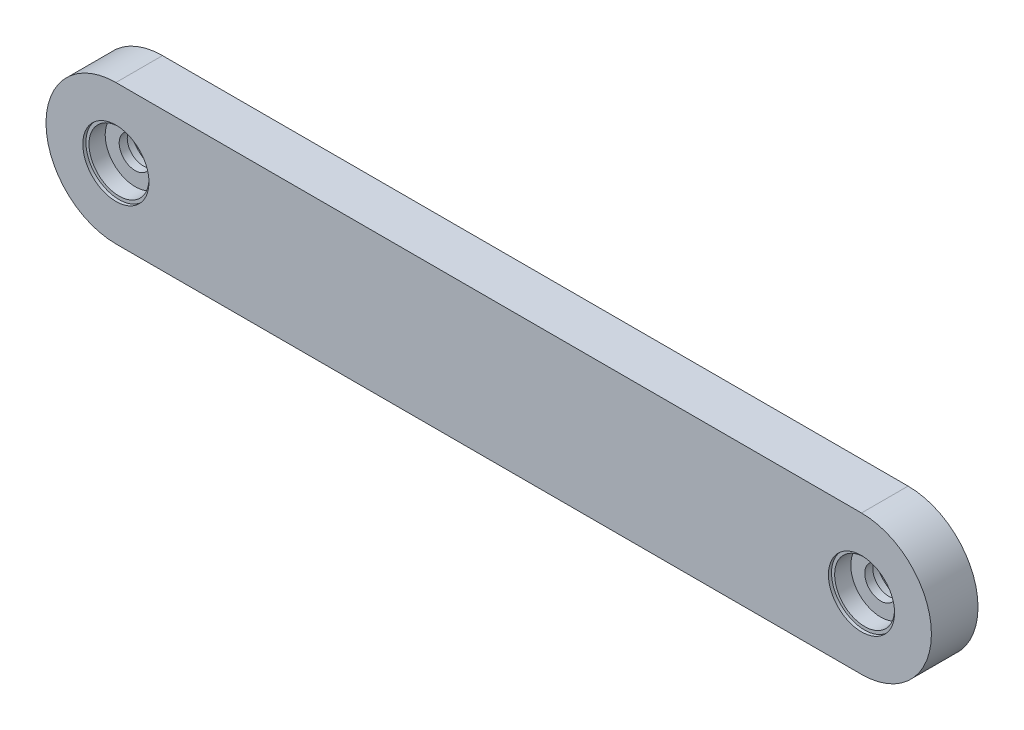
ISO-10303-21;
HEADER;
FILE_DESCRIPTION(('STEP AP214'),'2;1');
FILE_NAME('part.step','',(''),(''),'','','');
FILE_SCHEMA(('AUTOMOTIVE_DESIGN { 1 0 10303 214 1 1 1 1 }'));
ENDSEC;
DATA;
#1=APPLICATION_CONTEXT('core data for automotive mechanical design processes');
#2=APPLICATION_PROTOCOL_DEFINITION('international standard','automotive_design',2000,#1);
#3=PRODUCT_CONTEXT('',#1,'mechanical');
#4=PRODUCT('Part','Part','',(#3));
#5=PRODUCT_RELATED_PRODUCT_CATEGORY('part','',(#4));
#6=PRODUCT_DEFINITION_FORMATION('','',#4);
#7=PRODUCT_DEFINITION_CONTEXT('part definition',#1,'design');
#8=PRODUCT_DEFINITION('design','',#6,#7);
#9=PRODUCT_DEFINITION_SHAPE('','',#8);
#10=(LENGTH_UNIT() NAMED_UNIT(*) SI_UNIT(.MILLI.,.METRE.));
#11=(NAMED_UNIT(*) PLANE_ANGLE_UNIT() SI_UNIT($,.RADIAN.));
#12=(NAMED_UNIT(*) SI_UNIT($,.STERADIAN.) SOLID_ANGLE_UNIT());
#13=UNCERTAINTY_MEASURE_WITH_UNIT(LENGTH_MEASURE(1.E-05),#10,'distance_accuracy_value','');
#14=(GEOMETRIC_REPRESENTATION_CONTEXT(3) GLOBAL_UNCERTAINTY_ASSIGNED_CONTEXT((#13)) GLOBAL_UNIT_ASSIGNED_CONTEXT((#10,
#11,#12)) REPRESENTATION_CONTEXT('',''));
#15=CARTESIAN_POINT('',(0.,0.,0.));
#16=DIRECTION('',(0.,0.,1.));
#17=DIRECTION('',(1.,0.,0.));
#18=AXIS2_PLACEMENT_3D('',#15,#16,#17);
#19=CARTESIAN_POINT('',(0.,0.,0.));
#20=DIRECTION('',(0.,0.,1.));
#21=DIRECTION('',(1.,0.,0.));
#22=AXIS2_PLACEMENT_3D('',#19,#20,#21);
#23=CYLINDRICAL_SURFACE('',#22,22.5);
#24=CARTESIAN_POINT('',(0.,0.,15.));
#25=DIRECTION('',(0.,0.,1.));
#26=DIRECTION('',(1.,0.,0.));
#27=AXIS2_PLACEMENT_3D('',#24,#25,#26);
#28=CIRCLE('',#27,22.5);
#29=CARTESIAN_POINT('',(0.,22.5,15.));
#30=VERTEX_POINT('',#29);
#31=CARTESIAN_POINT('',(0.,-22.5,15.));
#32=VERTEX_POINT('',#31);
#33=EDGE_CURVE('E99',#30,#32,#28,.T.);
#34=ORIENTED_EDGE('',*,*,#33,.F.);
#35=DIRECTION('',(0.,0.,1.));
#36=VECTOR('',#35,1.);
#37=CARTESIAN_POINT('',(0.,22.5,0.));
#38=LINE('',#37,#36);
#39=CARTESIAN_POINT('',(0.,22.5,0.));
#40=VERTEX_POINT('',#39);
#41=EDGE_CURVE('E11',#40,#30,#38,.T.);
#42=ORIENTED_EDGE('',*,*,#41,.F.);
#43=CARTESIAN_POINT('',(0.,0.,0.));
#44=DIRECTION('',(0.,0.,1.));
#45=DIRECTION('',(1.,0.,0.));
#46=AXIS2_PLACEMENT_3D('',#43,#44,#45);
#47=CIRCLE('',#46,22.5);
#48=CARTESIAN_POINT('',(0.,-22.5,0.));
#49=VERTEX_POINT('',#48);
#50=EDGE_CURVE('E92',#40,#49,#47,.T.);
#51=ORIENTED_EDGE('',*,*,#50,.T.);
#52=DIRECTION('',(0.,0.,1.));
#53=VECTOR('',#52,1.);
#54=CARTESIAN_POINT('',(0.,-22.5,0.));
#55=LINE('',#54,#53);
#56=EDGE_CURVE('E37',#49,#32,#55,.T.);
#57=ORIENTED_EDGE('',*,*,#56,.T.);
#58=EDGE_LOOP('',(#34,#42,#51,#57));
#59=FACE_BOUND('',#58,.T.);
#60=ADVANCED_FACE('F34',(#59),#23,.T.);
#61=CARTESIAN_POINT('',(240.,22.5,0.));
#62=DIRECTION('',(0.,1.,0.));
#63=DIRECTION('',(0.,0.,1.));
#64=AXIS2_PLACEMENT_3D('',#61,#62,#63);
#65=PLANE('',#64);
#66=DIRECTION('',(-1.,0.,0.));
#67=VECTOR('',#66,1.);
#68=CARTESIAN_POINT('',(240.,22.5,15.));
#69=LINE('',#68,#67);
#70=CARTESIAN_POINT('',(240.,22.5,15.));
#71=VERTEX_POINT('',#70);
#72=EDGE_CURVE('E94',#71,#30,#69,.T.);
#73=ORIENTED_EDGE('',*,*,#72,.F.);
#74=DIRECTION('',(0.,0.,1.));
#75=VECTOR('',#74,1.);
#76=CARTESIAN_POINT('',(240.,22.5,0.));
#77=LINE('',#76,#75);
#78=CARTESIAN_POINT('',(240.,22.5,0.));
#79=VERTEX_POINT('',#78);
#80=EDGE_CURVE('E43',#79,#71,#77,.T.);
#81=ORIENTED_EDGE('',*,*,#80,.F.);
#82=DIRECTION('',(-1.,0.,0.));
#83=VECTOR('',#82,1.);
#84=CARTESIAN_POINT('',(240.,22.5,0.));
#85=LINE('',#84,#83);
#86=EDGE_CURVE('E89',#79,#40,#85,.T.);
#87=ORIENTED_EDGE('',*,*,#86,.T.);
#88=ORIENTED_EDGE('',*,*,#41,.T.);
#89=EDGE_LOOP('',(#73,#81,#87,#88));
#90=FACE_BOUND('',#89,.T.);
#91=ADVANCED_FACE('F110',(#90),#65,.T.);
#92=CARTESIAN_POINT('',(240.,0.,0.));
#93=DIRECTION('',(0.,0.,1.));
#94=DIRECTION('',(1.,0.,0.));
#95=AXIS2_PLACEMENT_3D('',#92,#93,#94);
#96=CYLINDRICAL_SURFACE('',#95,22.5);
#97=CARTESIAN_POINT('',(240.,0.,15.));
#98=DIRECTION('',(0.,0.,1.));
#99=DIRECTION('',(1.,0.,0.));
#100=AXIS2_PLACEMENT_3D('',#97,#98,#99);
#101=CIRCLE('',#100,22.5);
#102=CARTESIAN_POINT('',(240.,-22.5,15.));
#103=VERTEX_POINT('',#102);
#104=EDGE_CURVE('E84',#103,#71,#101,.T.);
#105=ORIENTED_EDGE('',*,*,#104,.F.);
#106=DIRECTION('',(0.,0.,1.));
#107=VECTOR('',#106,1.);
#108=CARTESIAN_POINT('',(240.,-22.5,0.));
#109=LINE('',#108,#107);
#110=CARTESIAN_POINT('',(240.,-22.5,0.));
#111=VERTEX_POINT('',#110);
#112=EDGE_CURVE('E79',#111,#103,#109,.T.);
#113=ORIENTED_EDGE('',*,*,#112,.F.);
#114=CARTESIAN_POINT('',(240.,0.,0.));
#115=DIRECTION('',(0.,0.,1.));
#116=DIRECTION('',(1.,0.,0.));
#117=AXIS2_PLACEMENT_3D('',#114,#115,#116);
#118=CIRCLE('',#117,22.5);
#119=EDGE_CURVE('E82',#111,#79,#118,.T.);
#120=ORIENTED_EDGE('',*,*,#119,.T.);
#121=ORIENTED_EDGE('',*,*,#80,.T.);
#122=EDGE_LOOP('',(#105,#113,#120,#121));
#123=FACE_BOUND('',#122,.T.);
#124=ADVANCED_FACE('F81',(#123),#96,.T.);
#125=CARTESIAN_POINT('',(0.,-22.5,0.));
#126=DIRECTION('',(0.,-1.,0.));
#127=DIRECTION('',(0.,0.,-1.));
#128=AXIS2_PLACEMENT_3D('',#125,#126,#127);
#129=PLANE('',#128);
#130=DIRECTION('',(1.,0.,0.));
#131=VECTOR('',#130,1.);
#132=CARTESIAN_POINT('',(0.,-22.5,15.));
#133=LINE('',#132,#131);
#134=EDGE_CURVE('E102',#32,#103,#133,.T.);
#135=ORIENTED_EDGE('',*,*,#134,.F.);
#136=ORIENTED_EDGE('',*,*,#56,.F.);
#137=DIRECTION('',(1.,0.,0.));
#138=VECTOR('',#137,1.);
#139=CARTESIAN_POINT('',(0.,-22.5,0.));
#140=LINE('',#139,#138);
#141=EDGE_CURVE('E88',#49,#111,#140,.T.);
#142=ORIENTED_EDGE('',*,*,#141,.T.);
#143=ORIENTED_EDGE('',*,*,#112,.T.);
#144=EDGE_LOOP('',(#135,#136,#142,#143));
#145=FACE_BOUND('',#144,.T.);
#146=ADVANCED_FACE('F91',(#145),#129,.T.);
#147=CARTESIAN_POINT('',(0.,0.,0.));
#148=DIRECTION('',(0.,0.,1.));
#149=DIRECTION('',(1.,0.,0.));
#150=AXIS2_PLACEMENT_3D('',#147,#148,#149);
#151=PLANE('',#150);
#152=CARTESIAN_POINT('',(0.,0.,0.));
#153=DIRECTION('',(0.,0.,-1.));
#154=DIRECTION('',(-1.,0.,0.));
#155=AXIS2_PLACEMENT_3D('',#152,#153,#154);
#156=CIRCLE('',#155,10.65);
#157=CARTESIAN_POINT('',(-10.65,0.,0.));
#158=VERTEX_POINT('',#157);
#159=EDGE_CURVE('E233',#158,#158,#156,.T.);
#160=ORIENTED_EDGE('',*,*,#159,.F.);
#161=EDGE_LOOP('',(#160));
#162=FACE_BOUND('',#161,.T.);
#163=CARTESIAN_POINT('',(240.,0.,0.));
#164=DIRECTION('',(0.,0.,-1.));
#165=DIRECTION('',(-1.,0.,0.));
#166=AXIS2_PLACEMENT_3D('',#163,#164,#165);
#167=CIRCLE('',#166,10.65);
#168=CARTESIAN_POINT('',(229.35,0.,0.));
#169=VERTEX_POINT('',#168);
#170=EDGE_CURVE('E263',#169,#169,#167,.T.);
#171=ORIENTED_EDGE('',*,*,#170,.F.);
#172=EDGE_LOOP('',(#171));
#173=FACE_BOUND('',#172,.T.);
#174=ORIENTED_EDGE('',*,*,#50,.F.);
#175=ORIENTED_EDGE('',*,*,#86,.F.);
#176=ORIENTED_EDGE('',*,*,#119,.F.);
#177=ORIENTED_EDGE('',*,*,#141,.F.);
#178=EDGE_LOOP('',(#174,#175,#176,#177));
#179=FACE_BOUND('',#178,.T.);
#180=ADVANCED_FACE('F87',(#162,#173,#179),#151,.F.);
#181=CARTESIAN_POINT('',(0.,0.,15.));
#182=DIRECTION('',(0.,0.,1.));
#183=DIRECTION('',(1.,0.,0.));
#184=AXIS2_PLACEMENT_3D('',#181,#182,#183);
#185=PLANE('',#184);
#186=CARTESIAN_POINT('',(0.,0.,15.));
#187=DIRECTION('',(0.,0.,-1.));
#188=DIRECTION('',(-1.,0.,0.));
#189=AXIS2_PLACEMENT_3D('',#186,#187,#188);
#190=CIRCLE('',#189,10.65);
#191=CARTESIAN_POINT('',(-10.65,0.,15.));
#192=VERTEX_POINT('',#191);
#193=EDGE_CURVE('E236',#192,#192,#190,.T.);
#194=ORIENTED_EDGE('',*,*,#193,.T.);
#195=EDGE_LOOP('',(#194));
#196=FACE_BOUND('',#195,.T.);
#197=CARTESIAN_POINT('',(240.,0.,15.));
#198=DIRECTION('',(0.,0.,-1.));
#199=DIRECTION('',(-1.,0.,0.));
#200=AXIS2_PLACEMENT_3D('',#197,#198,#199);
#201=CIRCLE('',#200,10.65);
#202=CARTESIAN_POINT('',(229.35,0.,15.));
#203=VERTEX_POINT('',#202);
#204=EDGE_CURVE('E103',#203,#203,#201,.T.);
#205=ORIENTED_EDGE('',*,*,#204,.T.);
#206=EDGE_LOOP('',(#205));
#207=FACE_BOUND('',#206,.T.);
#208=ORIENTED_EDGE('',*,*,#33,.T.);
#209=ORIENTED_EDGE('',*,*,#134,.T.);
#210=ORIENTED_EDGE('',*,*,#104,.T.);
#211=ORIENTED_EDGE('',*,*,#72,.T.);
#212=EDGE_LOOP('',(#208,#209,#210,#211));
#213=FACE_BOUND('',#212,.T.);
#214=ADVANCED_FACE('F109',(#196,#207,#213),#185,.T.);
#215=CARTESIAN_POINT('',(240.,0.,15.));
#216=DIRECTION('',(0.,0.,-1.));
#217=DIRECTION('',(-1.,0.,0.));
#218=AXIS2_PLACEMENT_3D('',#215,#216,#217);
#219=CYLINDRICAL_SURFACE('',#218,10.65);
#220=ORIENTED_EDGE('',*,*,#204,.F.);
#221=EDGE_LOOP('',(#220));
#222=FACE_BOUND('',#221,.T.);
#223=CARTESIAN_POINT('',(240.,0.,14.));
#224=DIRECTION('',(0.,0.,-1.));
#225=DIRECTION('',(-1.,0.,0.));
#226=AXIS2_PLACEMENT_3D('',#223,#224,#225);
#227=CIRCLE('',#226,10.65);
#228=CARTESIAN_POINT('',(229.35,0.,14.));
#229=VERTEX_POINT('',#228);
#230=EDGE_CURVE('E239',#229,#229,#227,.T.);
#231=ORIENTED_EDGE('',*,*,#230,.T.);
#232=EDGE_LOOP('',(#231));
#233=FACE_BOUND('',#232,.T.);
#234=ADVANCED_FACE('F128',(#222,#233),#219,.F.);
#235=CARTESIAN_POINT('',(240.,0.,15.));
#236=DIRECTION('',(0.,0.,-1.));
#237=DIRECTION('',(-1.,0.,0.));
#238=AXIS2_PLACEMENT_3D('',#235,#236,#237);
#239=CYLINDRICAL_SURFACE('',#238,10.65);
#240=CARTESIAN_POINT('',(240.,0.,1.));
#241=DIRECTION('',(0.,0.,-1.));
#242=DIRECTION('',(-1.,0.,0.));
#243=AXIS2_PLACEMENT_3D('',#240,#241,#242);
#244=CIRCLE('',#243,10.65);
#245=CARTESIAN_POINT('',(229.35,0.,1.));
#246=VERTEX_POINT('',#245);
#247=EDGE_CURVE('E260',#246,#246,#244,.T.);
#248=ORIENTED_EDGE('',*,*,#247,.F.);
#249=EDGE_LOOP('',(#248));
#250=FACE_BOUND('',#249,.T.);
#251=ORIENTED_EDGE('',*,*,#170,.T.);
#252=EDGE_LOOP('',(#251));
#253=FACE_BOUND('',#252,.T.);
#254=ADVANCED_FACE('F135',(#250,#253),#239,.F.);
#255=CARTESIAN_POINT('',(250.65,0.,1.));
#256=DIRECTION('',(0.,0.,1.));
#257=DIRECTION('',(1.,0.,0.));
#258=AXIS2_PLACEMENT_3D('',#255,#256,#257);
#259=PLANE('',#258);
#260=CARTESIAN_POINT('',(240.,0.,1.));
#261=DIRECTION('',(0.,0.,-1.));
#262=DIRECTION('',(-1.,0.,0.));
#263=AXIS2_PLACEMENT_3D('',#260,#261,#262);
#264=CIRCLE('',#263,9.64999999999999);
#265=CARTESIAN_POINT('',(230.35,0.,1.));
#266=VERTEX_POINT('',#265);
#267=EDGE_CURVE('E257',#266,#266,#264,.T.);
#268=ORIENTED_EDGE('',*,*,#267,.F.);
#269=EDGE_LOOP('',(#268));
#270=FACE_BOUND('',#269,.T.);
#271=ORIENTED_EDGE('',*,*,#247,.T.);
#272=EDGE_LOOP('',(#271));
#273=FACE_BOUND('',#272,.T.);
#274=ADVANCED_FACE('F139',(#270,#273),#259,.F.);
#275=CARTESIAN_POINT('',(240.,0.,15.));
#276=DIRECTION('',(0.,0.,-1.));
#277=DIRECTION('',(-1.,0.,0.));
#278=AXIS2_PLACEMENT_3D('',#275,#276,#277);
#279=CYLINDRICAL_SURFACE('',#278,9.65000000000001);
#280=CARTESIAN_POINT('',(240.,0.,6.2));
#281=DIRECTION('',(0.,0.,-1.));
#282=DIRECTION('',(-1.,0.,0.));
#283=AXIS2_PLACEMENT_3D('',#280,#281,#282);
#284=CIRCLE('',#283,9.65000000000002);
#285=CARTESIAN_POINT('',(230.35,0.,6.2));
#286=VERTEX_POINT('',#285);
#287=EDGE_CURVE('E254',#286,#286,#284,.T.);
#288=ORIENTED_EDGE('',*,*,#287,.F.);
#289=EDGE_LOOP('',(#288));
#290=FACE_BOUND('',#289,.T.);
#291=ORIENTED_EDGE('',*,*,#267,.T.);
#292=EDGE_LOOP('',(#291));
#293=FACE_BOUND('',#292,.T.);
#294=ADVANCED_FACE('F143',(#290,#293),#279,.F.);
#295=CARTESIAN_POINT('',(249.65,0.,6.2));
#296=DIRECTION('',(0.,0.,1.));
#297=DIRECTION('',(1.,0.,0.));
#298=AXIS2_PLACEMENT_3D('',#295,#296,#297);
#299=PLANE('',#298);
#300=CARTESIAN_POINT('',(240.,0.,6.2));
#301=DIRECTION('',(0.,0.,-1.));
#302=DIRECTION('',(-1.,0.,0.));
#303=AXIS2_PLACEMENT_3D('',#300,#301,#302);
#304=CIRCLE('',#303,5.14999999999999);
#305=CARTESIAN_POINT('',(234.85,0.,6.2));
#306=VERTEX_POINT('',#305);
#307=EDGE_CURVE('E251',#306,#306,#304,.T.);
#308=ORIENTED_EDGE('',*,*,#307,.F.);
#309=EDGE_LOOP('',(#308));
#310=FACE_BOUND('',#309,.T.);
#311=ORIENTED_EDGE('',*,*,#287,.T.);
#312=EDGE_LOOP('',(#311));
#313=FACE_BOUND('',#312,.T.);
#314=ADVANCED_FACE('F147',(#310,#313),#299,.F.);
#315=CARTESIAN_POINT('',(240.,0.,15.));
#316=DIRECTION('',(0.,0.,-1.));
#317=DIRECTION('',(-1.,0.,0.));
#318=AXIS2_PLACEMENT_3D('',#315,#316,#317);
#319=CYLINDRICAL_SURFACE('',#318,5.14999999999999);
#320=CARTESIAN_POINT('',(240.,0.,8.8));
#321=DIRECTION('',(0.,0.,-1.));
#322=DIRECTION('',(-1.,0.,0.));
#323=AXIS2_PLACEMENT_3D('',#320,#321,#322);
#324=CIRCLE('',#323,5.14999999999999);
#325=CARTESIAN_POINT('',(234.85,0.,8.8));
#326=VERTEX_POINT('',#325);
#327=EDGE_CURVE('E248',#326,#326,#324,.T.);
#328=ORIENTED_EDGE('',*,*,#327,.F.);
#329=EDGE_LOOP('',(#328));
#330=FACE_BOUND('',#329,.T.);
#331=ORIENTED_EDGE('',*,*,#307,.T.);
#332=EDGE_LOOP('',(#331));
#333=FACE_BOUND('',#332,.T.);
#334=ADVANCED_FACE('F151',(#330,#333),#319,.F.);
#335=CARTESIAN_POINT('',(245.15,0.,8.8));
#336=DIRECTION('',(0.,0.,-1.));
#337=DIRECTION('',(-1.,0.,0.));
#338=AXIS2_PLACEMENT_3D('',#335,#336,#337);
#339=PLANE('',#338);
#340=CARTESIAN_POINT('',(240.,0.,8.8));
#341=DIRECTION('',(0.,0.,-1.));
#342=DIRECTION('',(-1.,0.,0.));
#343=AXIS2_PLACEMENT_3D('',#340,#341,#342);
#344=CIRCLE('',#343,9.64999999999999);
#345=CARTESIAN_POINT('',(230.35,0.,8.8));
#346=VERTEX_POINT('',#345);
#347=EDGE_CURVE('E245',#346,#346,#344,.T.);
#348=ORIENTED_EDGE('',*,*,#347,.F.);
#349=EDGE_LOOP('',(#348));
#350=FACE_BOUND('',#349,.T.);
#351=ORIENTED_EDGE('',*,*,#327,.T.);
#352=EDGE_LOOP('',(#351));
#353=FACE_BOUND('',#352,.T.);
#354=ADVANCED_FACE('F155',(#350,#353),#339,.F.);
#355=CARTESIAN_POINT('',(240.,0.,15.));
#356=DIRECTION('',(0.,0.,-1.));
#357=DIRECTION('',(-1.,0.,0.));
#358=AXIS2_PLACEMENT_3D('',#355,#356,#357);
#359=CYLINDRICAL_SURFACE('',#358,9.64999999999999);
#360=CARTESIAN_POINT('',(240.,0.,14.));
#361=DIRECTION('',(0.,0.,-1.));
#362=DIRECTION('',(-1.,0.,0.));
#363=AXIS2_PLACEMENT_3D('',#360,#361,#362);
#364=CIRCLE('',#363,9.64999999999999);
#365=CARTESIAN_POINT('',(230.35,0.,14.));
#366=VERTEX_POINT('',#365);
#367=EDGE_CURVE('E242',#366,#366,#364,.T.);
#368=ORIENTED_EDGE('',*,*,#367,.F.);
#369=EDGE_LOOP('',(#368));
#370=FACE_BOUND('',#369,.T.);
#371=ORIENTED_EDGE('',*,*,#347,.T.);
#372=EDGE_LOOP('',(#371));
#373=FACE_BOUND('',#372,.T.);
#374=ADVANCED_FACE('F159',(#370,#373),#359,.F.);
#375=CARTESIAN_POINT('',(249.65,0.,14.));
#376=DIRECTION('',(0.,0.,-1.));
#377=DIRECTION('',(-1.,0.,0.));
#378=AXIS2_PLACEMENT_3D('',#375,#376,#377);
#379=PLANE('',#378);
#380=ORIENTED_EDGE('',*,*,#230,.F.);
#381=EDGE_LOOP('',(#380));
#382=FACE_BOUND('',#381,.T.);
#383=ORIENTED_EDGE('',*,*,#367,.T.);
#384=EDGE_LOOP('',(#383));
#385=FACE_BOUND('',#384,.T.);
#386=ADVANCED_FACE('F163',(#382,#385),#379,.F.);
#387=CARTESIAN_POINT('',(0.,0.,15.));
#388=DIRECTION('',(0.,0.,-1.));
#389=DIRECTION('',(-1.,0.,0.));
#390=AXIS2_PLACEMENT_3D('',#387,#388,#389);
#391=CYLINDRICAL_SURFACE('',#390,10.65);
#392=ORIENTED_EDGE('',*,*,#193,.F.);
#393=EDGE_LOOP('',(#392));
#394=FACE_BOUND('',#393,.T.);
#395=CARTESIAN_POINT('',(0.,0.,14.));
#396=DIRECTION('',(0.,0.,-1.));
#397=DIRECTION('',(-1.,0.,0.));
#398=AXIS2_PLACEMENT_3D('',#395,#396,#397);
#399=CIRCLE('',#398,10.65);
#400=CARTESIAN_POINT('',(-10.65,0.,14.));
#401=VERTEX_POINT('',#400);
#402=EDGE_CURVE('E208',#401,#401,#399,.T.);
#403=ORIENTED_EDGE('',*,*,#402,.T.);
#404=EDGE_LOOP('',(#403));
#405=FACE_BOUND('',#404,.T.);
#406=ADVANCED_FACE('F167',(#394,#405),#391,.F.);
#407=CARTESIAN_POINT('',(0.,0.,15.));
#408=DIRECTION('',(0.,0.,-1.));
#409=DIRECTION('',(-1.,0.,0.));
#410=AXIS2_PLACEMENT_3D('',#407,#408,#409);
#411=CYLINDRICAL_SURFACE('',#410,10.65);
#412=CARTESIAN_POINT('',(0.,0.,1.));
#413=DIRECTION('',(0.,0.,-1.));
#414=DIRECTION('',(-1.,0.,0.));
#415=AXIS2_PLACEMENT_3D('',#412,#413,#414);
#416=CIRCLE('',#415,10.65);
#417=CARTESIAN_POINT('',(-10.65,0.,1.));
#418=VERTEX_POINT('',#417);
#419=EDGE_CURVE('E230',#418,#418,#416,.T.);
#420=ORIENTED_EDGE('',*,*,#419,.F.);
#421=EDGE_LOOP('',(#420));
#422=FACE_BOUND('',#421,.T.);
#423=ORIENTED_EDGE('',*,*,#159,.T.);
#424=EDGE_LOOP('',(#423));
#425=FACE_BOUND('',#424,.T.);
#426=ADVANCED_FACE('F171',(#422,#425),#411,.F.);
#427=CARTESIAN_POINT('',(10.65,0.,1.));
#428=DIRECTION('',(0.,0.,1.));
#429=DIRECTION('',(1.,0.,0.));
#430=AXIS2_PLACEMENT_3D('',#427,#428,#429);
#431=PLANE('',#430);
#432=CARTESIAN_POINT('',(0.,0.,1.));
#433=DIRECTION('',(0.,0.,-1.));
#434=DIRECTION('',(-1.,0.,0.));
#435=AXIS2_PLACEMENT_3D('',#432,#433,#434);
#436=CIRCLE('',#435,9.65);
#437=CARTESIAN_POINT('',(-9.65,0.,1.));
#438=VERTEX_POINT('',#437);
#439=EDGE_CURVE('E227',#438,#438,#436,.T.);
#440=ORIENTED_EDGE('',*,*,#439,.F.);
#441=EDGE_LOOP('',(#440));
#442=FACE_BOUND('',#441,.T.);
#443=ORIENTED_EDGE('',*,*,#419,.T.);
#444=EDGE_LOOP('',(#443));
#445=FACE_BOUND('',#444,.T.);
#446=ADVANCED_FACE('F175',(#442,#445),#431,.F.);
#447=CARTESIAN_POINT('',(0.,0.,15.));
#448=DIRECTION('',(0.,0.,-1.));
#449=DIRECTION('',(-1.,0.,0.));
#450=AXIS2_PLACEMENT_3D('',#447,#448,#449);
#451=CYLINDRICAL_SURFACE('',#450,9.65);
#452=CARTESIAN_POINT('',(0.,0.,6.2));
#453=DIRECTION('',(0.,0.,-1.));
#454=DIRECTION('',(-1.,0.,0.));
#455=AXIS2_PLACEMENT_3D('',#452,#453,#454);
#456=CIRCLE('',#455,9.65);
#457=CARTESIAN_POINT('',(-9.65,0.,6.2));
#458=VERTEX_POINT('',#457);
#459=EDGE_CURVE('E224',#458,#458,#456,.T.);
#460=ORIENTED_EDGE('',*,*,#459,.F.);
#461=EDGE_LOOP('',(#460));
#462=FACE_BOUND('',#461,.T.);
#463=ORIENTED_EDGE('',*,*,#439,.T.);
#464=EDGE_LOOP('',(#463));
#465=FACE_BOUND('',#464,.T.);
#466=ADVANCED_FACE('F179',(#462,#465),#451,.F.);
#467=CARTESIAN_POINT('',(9.65,0.,6.2));
#468=DIRECTION('',(0.,0.,1.));
#469=DIRECTION('',(1.,0.,0.));
#470=AXIS2_PLACEMENT_3D('',#467,#468,#469);
#471=PLANE('',#470);
#472=CARTESIAN_POINT('',(0.,0.,6.2));
#473=DIRECTION('',(0.,0.,-1.));
#474=DIRECTION('',(-1.,0.,0.));
#475=AXIS2_PLACEMENT_3D('',#472,#473,#474);
#476=CIRCLE('',#475,5.15);
#477=CARTESIAN_POINT('',(-5.15,0.,6.2));
#478=VERTEX_POINT('',#477);
#479=EDGE_CURVE('E221',#478,#478,#476,.T.);
#480=ORIENTED_EDGE('',*,*,#479,.F.);
#481=EDGE_LOOP('',(#480));
#482=FACE_BOUND('',#481,.T.);
#483=ORIENTED_EDGE('',*,*,#459,.T.);
#484=EDGE_LOOP('',(#483));
#485=FACE_BOUND('',#484,.T.);
#486=ADVANCED_FACE('F183',(#482,#485),#471,.F.);
#487=CARTESIAN_POINT('',(0.,0.,15.));
#488=DIRECTION('',(0.,0.,-1.));
#489=DIRECTION('',(-1.,0.,0.));
#490=AXIS2_PLACEMENT_3D('',#487,#488,#489);
#491=CYLINDRICAL_SURFACE('',#490,5.15);
#492=CARTESIAN_POINT('',(0.,0.,8.8));
#493=DIRECTION('',(0.,0.,-1.));
#494=DIRECTION('',(-1.,0.,0.));
#495=AXIS2_PLACEMENT_3D('',#492,#493,#494);
#496=CIRCLE('',#495,5.15);
#497=CARTESIAN_POINT('',(-5.15,0.,8.8));
#498=VERTEX_POINT('',#497);
#499=EDGE_CURVE('E215',#498,#498,#496,.T.);
#500=ORIENTED_EDGE('',*,*,#499,.F.);
#501=EDGE_LOOP('',(#500));
#502=FACE_BOUND('',#501,.T.);
#503=ORIENTED_EDGE('',*,*,#479,.T.);
#504=EDGE_LOOP('',(#503));
#505=FACE_BOUND('',#504,.T.);
#506=ADVANCED_FACE('F187',(#502,#505),#491,.F.);
#507=CARTESIAN_POINT('',(5.15,0.,8.8));
#508=DIRECTION('',(0.,0.,-1.));
#509=DIRECTION('',(-1.,0.,0.));
#510=AXIS2_PLACEMENT_3D('',#507,#508,#509);
#511=PLANE('',#510);
#512=CARTESIAN_POINT('',(0.,0.,8.8));
#513=DIRECTION('',(0.,0.,-1.));
#514=DIRECTION('',(-1.,0.,0.));
#515=AXIS2_PLACEMENT_3D('',#512,#513,#514);
#516=CIRCLE('',#515,9.65);
#517=CARTESIAN_POINT('',(-9.65,0.,8.8));
#518=VERTEX_POINT('',#517);
#519=EDGE_CURVE('E212',#518,#518,#516,.T.);
#520=ORIENTED_EDGE('',*,*,#519,.F.);
#521=EDGE_LOOP('',(#520));
#522=FACE_BOUND('',#521,.T.);
#523=ORIENTED_EDGE('',*,*,#499,.T.);
#524=EDGE_LOOP('',(#523));
#525=FACE_BOUND('',#524,.T.);
#526=ADVANCED_FACE('F191',(#522,#525),#511,.F.);
#527=CARTESIAN_POINT('',(0.,0.,15.));
#528=DIRECTION('',(0.,0.,-1.));
#529=DIRECTION('',(-1.,0.,0.));
#530=AXIS2_PLACEMENT_3D('',#527,#528,#529);
#531=CYLINDRICAL_SURFACE('',#530,9.65);
#532=CARTESIAN_POINT('',(0.,0.,14.));
#533=DIRECTION('',(0.,0.,-1.));
#534=DIRECTION('',(-1.,0.,0.));
#535=AXIS2_PLACEMENT_3D('',#532,#533,#534);
#536=CIRCLE('',#535,9.65);
#537=CARTESIAN_POINT('',(-9.65,0.,14.));
#538=VERTEX_POINT('',#537);
#539=EDGE_CURVE('E211',#538,#538,#536,.T.);
#540=ORIENTED_EDGE('',*,*,#539,.F.);
#541=EDGE_LOOP('',(#540));
#542=FACE_BOUND('',#541,.T.);
#543=ORIENTED_EDGE('',*,*,#519,.T.);
#544=EDGE_LOOP('',(#543));
#545=FACE_BOUND('',#544,.T.);
#546=ADVANCED_FACE('F195',(#542,#545),#531,.F.);
#547=CARTESIAN_POINT('',(9.65,0.,14.));
#548=DIRECTION('',(0.,0.,-1.));
#549=DIRECTION('',(-1.,0.,0.));
#550=AXIS2_PLACEMENT_3D('',#547,#548,#549);
#551=PLANE('',#550);
#552=ORIENTED_EDGE('',*,*,#402,.F.);
#553=EDGE_LOOP('',(#552));
#554=FACE_BOUND('',#553,.T.);
#555=ORIENTED_EDGE('',*,*,#539,.T.);
#556=EDGE_LOOP('',(#555));
#557=FACE_BOUND('',#556,.T.);
#558=ADVANCED_FACE('F199',(#554,#557),#551,.F.);
#559=CLOSED_SHELL('',(#60,#91,#124,#146,#180,#214,#234,#254,#274,#294,#314,#334,#354,#374,#386,
#406,#426,#446,#466,#486,#506,#526,#546,#558));
#560=MANIFOLD_SOLID_BREP('B2',#559);
#561=ADVANCED_BREP_SHAPE_REPRESENTATION('',(#18,#560),#14);
#562=SHAPE_DEFINITION_REPRESENTATION(#9,#561);
ENDSEC;
END-ISO-10303-21;
